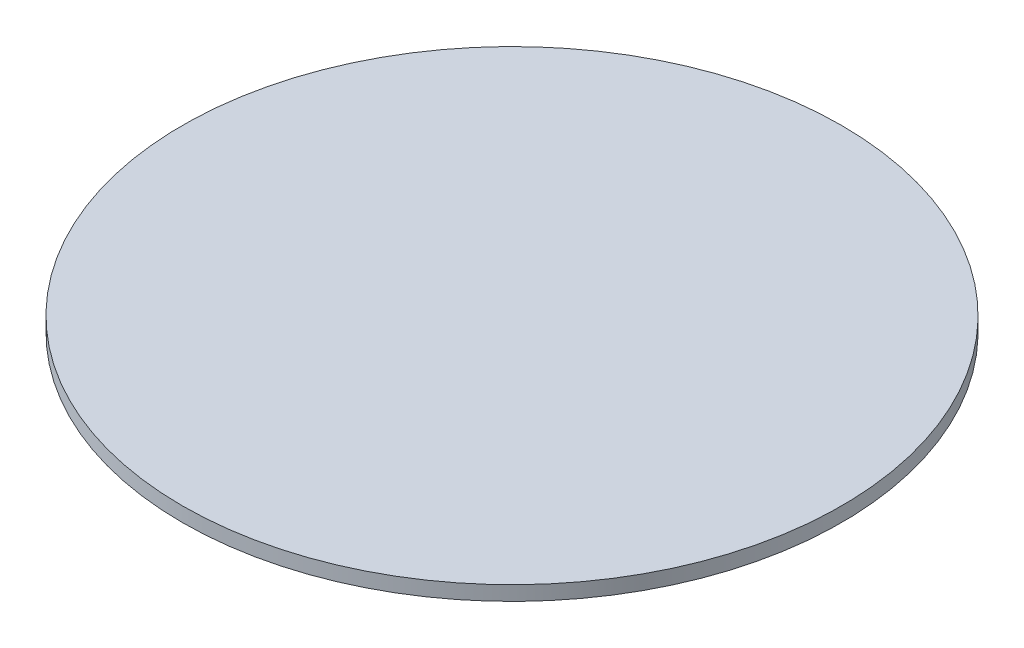
ISO-10303-21;
HEADER;
FILE_DESCRIPTION(('STEP AP214'),'2;1');
FILE_NAME('part.step','',(''),(''),'','','');
FILE_SCHEMA(('AUTOMOTIVE_DESIGN { 1 0 10303 214 1 1 1 1 }'));
ENDSEC;
DATA;
#1=APPLICATION_CONTEXT('core data for automotive mechanical design processes');
#2=APPLICATION_PROTOCOL_DEFINITION('international standard','automotive_design',2000,#1);
#3=PRODUCT_CONTEXT('',#1,'mechanical');
#4=PRODUCT('Part','Part','',(#3));
#5=PRODUCT_RELATED_PRODUCT_CATEGORY('part','',(#4));
#6=PRODUCT_DEFINITION_FORMATION('','',#4);
#7=PRODUCT_DEFINITION_CONTEXT('part definition',#1,'design');
#8=PRODUCT_DEFINITION('design','',#6,#7);
#9=PRODUCT_DEFINITION_SHAPE('','',#8);
#10=(LENGTH_UNIT() NAMED_UNIT(*) SI_UNIT(.MILLI.,.METRE.));
#11=(NAMED_UNIT(*) PLANE_ANGLE_UNIT() SI_UNIT($,.RADIAN.));
#12=(NAMED_UNIT(*) SI_UNIT($,.STERADIAN.) SOLID_ANGLE_UNIT());
#13=UNCERTAINTY_MEASURE_WITH_UNIT(LENGTH_MEASURE(1.E-05),#10,'distance_accuracy_value','');
#14=(GEOMETRIC_REPRESENTATION_CONTEXT(3) GLOBAL_UNCERTAINTY_ASSIGNED_CONTEXT((#13)) GLOBAL_UNIT_ASSIGNED_CONTEXT((#10,
#11,#12)) REPRESENTATION_CONTEXT('',''));
#15=CARTESIAN_POINT('',(0.,0.,0.));
#16=DIRECTION('',(0.,0.,1.));
#17=DIRECTION('',(1.,0.,0.));
#18=AXIS2_PLACEMENT_3D('',#15,#16,#17);
#19=CARTESIAN_POINT('',(0.,1.1,0.));
#20=DIRECTION('',(0.,-1.,0.));
#21=DIRECTION('',(0.,0.,-1.));
#22=AXIS2_PLACEMENT_3D('',#19,#20,#21);
#23=CYLINDRICAL_SURFACE('',#22,25.);
#24=CARTESIAN_POINT('',(0.,1.1,0.));
#25=DIRECTION('',(0.,1.,0.));
#26=DIRECTION('',(0.,0.,1.));
#27=AXIS2_PLACEMENT_3D('',#24,#25,#26);
#28=CIRCLE('',#27,25.);
#29=CARTESIAN_POINT('',(0.,1.1,25.));
#30=VERTEX_POINT('',#29);
#31=EDGE_CURVE('E10',#30,#30,#28,.T.);
#32=ORIENTED_EDGE('',*,*,#31,.F.);
#33=EDGE_LOOP('',(#32));
#34=FACE_BOUND('',#33,.T.);
#35=CARTESIAN_POINT('',(0.,0.,0.));
#36=DIRECTION('',(0.,1.,0.));
#37=DIRECTION('',(0.,0.,1.));
#38=AXIS2_PLACEMENT_3D('',#35,#36,#37);
#39=CIRCLE('',#38,25.);
#40=CARTESIAN_POINT('',(0.,0.,25.));
#41=VERTEX_POINT('',#40);
#42=EDGE_CURVE('E35',#41,#41,#39,.T.);
#43=ORIENTED_EDGE('',*,*,#42,.T.);
#44=EDGE_LOOP('',(#43));
#45=FACE_BOUND('',#44,.T.);
#46=ADVANCED_FACE('F32',(#34,#45),#23,.T.);
#47=CARTESIAN_POINT('',(0.,1.1,0.));
#48=DIRECTION('',(0.,1.,0.));
#49=DIRECTION('',(0.,0.,1.));
#50=AXIS2_PLACEMENT_3D('',#47,#48,#49);
#51=PLANE('',#50);
#52=ORIENTED_EDGE('',*,*,#31,.T.);
#53=EDGE_LOOP('',(#52));
#54=FACE_BOUND('',#53,.T.);
#55=ADVANCED_FACE('F47',(#54),#51,.T.);
#56=CARTESIAN_POINT('',(0.,0.,0.));
#57=DIRECTION('',(0.,1.,0.));
#58=DIRECTION('',(0.,0.,1.));
#59=AXIS2_PLACEMENT_3D('',#56,#57,#58);
#60=PLANE('',#59);
#61=ORIENTED_EDGE('',*,*,#42,.F.);
#62=EDGE_LOOP('',(#61));
#63=FACE_BOUND('',#62,.T.);
#64=ADVANCED_FACE('F45',(#63),#60,.F.);
#65=CLOSED_SHELL('',(#46,#55,#64));
#66=MANIFOLD_SOLID_BREP('B2',#65);
#67=ADVANCED_BREP_SHAPE_REPRESENTATION('',(#18,#66),#14);
#68=SHAPE_DEFINITION_REPRESENTATION(#9,#67);
ENDSEC;
END-ISO-10303-21;
